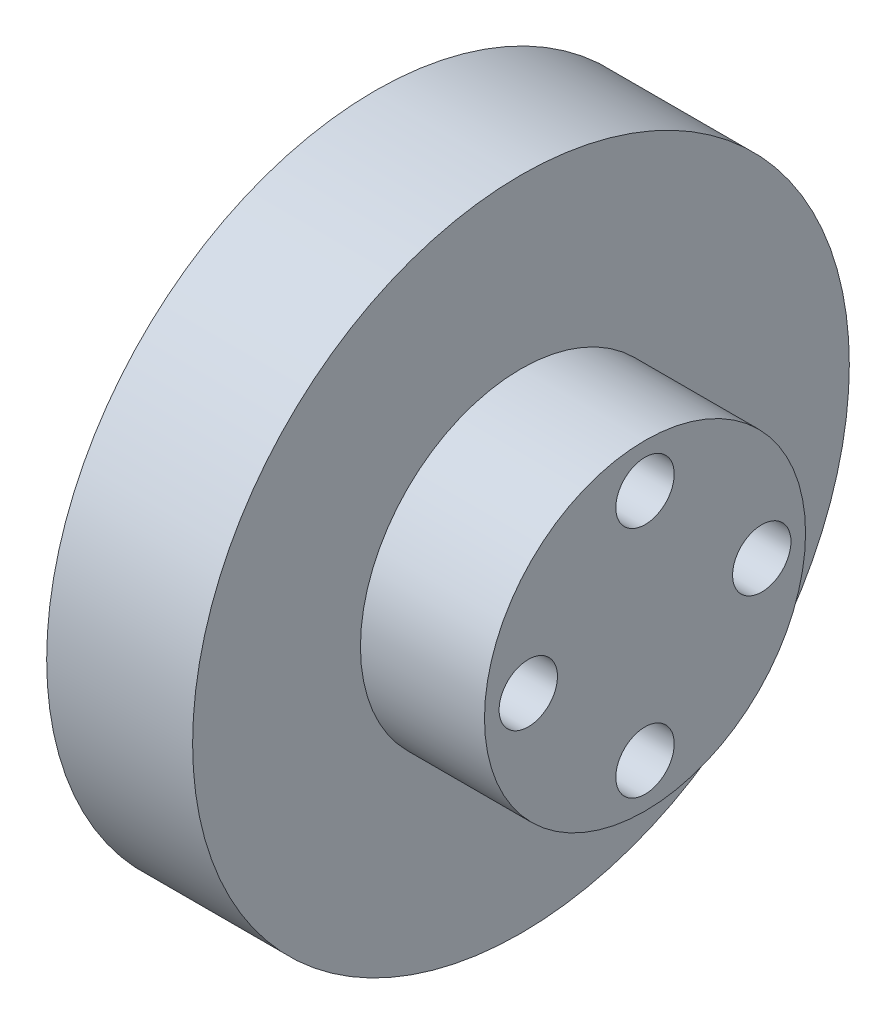
ISO-10303-21;
HEADER;
FILE_DESCRIPTION(('STEP AP214'),'2;1');
FILE_NAME('part.step','',(''),(''),'','','');
FILE_SCHEMA(('AUTOMOTIVE_DESIGN { 1 0 10303 214 1 1 1 1 }'));
ENDSEC;
DATA;
#1=APPLICATION_CONTEXT('core data for automotive mechanical design processes');
#2=APPLICATION_PROTOCOL_DEFINITION('international standard','automotive_design',2000,#1);
#3=PRODUCT_CONTEXT('',#1,'mechanical');
#4=PRODUCT('Part','Part','',(#3));
#5=PRODUCT_RELATED_PRODUCT_CATEGORY('part','',(#4));
#6=PRODUCT_DEFINITION_FORMATION('','',#4);
#7=PRODUCT_DEFINITION_CONTEXT('part definition',#1,'design');
#8=PRODUCT_DEFINITION('design','',#6,#7);
#9=PRODUCT_DEFINITION_SHAPE('','',#8);
#10=(LENGTH_UNIT() NAMED_UNIT(*) SI_UNIT(.MILLI.,.METRE.));
#11=(NAMED_UNIT(*) PLANE_ANGLE_UNIT() SI_UNIT($,.RADIAN.));
#12=(NAMED_UNIT(*) SI_UNIT($,.STERADIAN.) SOLID_ANGLE_UNIT());
#13=UNCERTAINTY_MEASURE_WITH_UNIT(LENGTH_MEASURE(1.E-05),#10,'distance_accuracy_value','');
#14=(GEOMETRIC_REPRESENTATION_CONTEXT(3) GLOBAL_UNCERTAINTY_ASSIGNED_CONTEXT((#13)) GLOBAL_UNIT_ASSIGNED_CONTEXT((#10,
#11,#12)) REPRESENTATION_CONTEXT('',''));
#15=CARTESIAN_POINT('',(0.,0.,0.));
#16=DIRECTION('',(0.,0.,1.));
#17=DIRECTION('',(1.,0.,0.));
#18=AXIS2_PLACEMENT_3D('',#15,#16,#17);
#19=CARTESIAN_POINT('',(10.,0.,0.));
#20=DIRECTION('',(-1.,0.,0.));
#21=DIRECTION('',(0.,0.,1.));
#22=AXIS2_PLACEMENT_3D('',#19,#20,#21);
#23=CYLINDRICAL_SURFACE('',#22,22.5);
#24=CARTESIAN_POINT('',(10.,0.,0.));
#25=DIRECTION('',(1.,0.,0.));
#26=DIRECTION('',(0.,0.,-1.));
#27=AXIS2_PLACEMENT_3D('',#24,#25,#26);
#28=CIRCLE('',#27,22.5);
#29=CARTESIAN_POINT('',(10.,0.,-22.5));
#30=VERTEX_POINT('',#29);
#31=EDGE_CURVE('E37',#30,#30,#28,.T.);
#32=ORIENTED_EDGE('',*,*,#31,.F.);
#33=EDGE_LOOP('',(#32));
#34=FACE_BOUND('',#33,.T.);
#35=CARTESIAN_POINT('',(0.,0.,0.));
#36=DIRECTION('',(1.,0.,0.));
#37=DIRECTION('',(0.,0.,-1.));
#38=AXIS2_PLACEMENT_3D('',#35,#36,#37);
#39=CIRCLE('',#38,22.5);
#40=CARTESIAN_POINT('',(0.,0.,-22.5));
#41=VERTEX_POINT('',#40);
#42=EDGE_CURVE('E33',#41,#41,#39,.T.);
#43=ORIENTED_EDGE('',*,*,#42,.T.);
#44=EDGE_LOOP('',(#43));
#45=FACE_BOUND('',#44,.T.);
#46=ADVANCED_FACE('F30',(#34,#45),#23,.T.);
#47=CARTESIAN_POINT('',(10.,0.,0.));
#48=DIRECTION('',(1.,0.,0.));
#49=DIRECTION('',(0.,0.,-1.));
#50=AXIS2_PLACEMENT_3D('',#47,#48,#49);
#51=PLANE('',#50);
#52=CARTESIAN_POINT('',(10.,0.,0.));
#53=DIRECTION('',(1.,0.,0.));
#54=DIRECTION('',(0.,0.,-1.));
#55=AXIS2_PLACEMENT_3D('',#52,#53,#54);
#56=CIRCLE('',#55,11.);
#57=CARTESIAN_POINT('',(10.,0.,-11.));
#58=VERTEX_POINT('',#57);
#59=EDGE_CURVE('E10',#58,#58,#56,.T.);
#60=ORIENTED_EDGE('',*,*,#59,.F.);
#61=EDGE_LOOP('',(#60));
#62=FACE_BOUND('',#61,.T.);
#63=ORIENTED_EDGE('',*,*,#31,.T.);
#64=EDGE_LOOP('',(#63));
#65=FACE_BOUND('',#64,.T.);
#66=ADVANCED_FACE('F100',(#62,#65),#51,.T.);
#67=CARTESIAN_POINT('',(0.,0.,0.));
#68=DIRECTION('',(1.,0.,0.));
#69=DIRECTION('',(0.,0.,-1.));
#70=AXIS2_PLACEMENT_3D('',#67,#68,#69);
#71=PLANE('',#70);
#72=CARTESIAN_POINT('',(0.,8.,0.));
#73=DIRECTION('',(1.,0.,0.));
#74=DIRECTION('',(0.,0.,-1.));
#75=AXIS2_PLACEMENT_3D('',#72,#73,#74);
#76=CIRCLE('',#75,2.);
#77=CARTESIAN_POINT('',(0.,8.,-2.));
#78=VERTEX_POINT('',#77);
#79=EDGE_CURVE('E46',#78,#78,#76,.T.);
#80=ORIENTED_EDGE('',*,*,#79,.T.);
#81=EDGE_LOOP('',(#80));
#82=FACE_BOUND('',#81,.T.);
#83=CARTESIAN_POINT('',(0.,1.41373759072532E-13,-8.00000000000014));
#84=DIRECTION('',(1.,0.,0.));
#85=DIRECTION('',(0.,0.,-1.));
#86=AXIS2_PLACEMENT_3D('',#83,#84,#85);
#87=CIRCLE('',#86,2.);
#88=CARTESIAN_POINT('',(0.,1.41373759072532E-13,-10.0000000000001));
#89=VERTEX_POINT('',#88);
#90=EDGE_CURVE('E62',#89,#89,#87,.T.);
#91=ORIENTED_EDGE('',*,*,#90,.T.);
#92=EDGE_LOOP('',(#91));
#93=FACE_BOUND('',#92,.T.);
#94=CARTESIAN_POINT('',(0.,-8.,-2.82747518145063E-13));
#95=DIRECTION('',(1.,0.,0.));
#96=DIRECTION('',(0.,0.,-1.));
#97=AXIS2_PLACEMENT_3D('',#94,#95,#96);
#98=CIRCLE('',#97,2.);
#99=CARTESIAN_POINT('',(0.,-8.,-2.00000000000028));
#100=VERTEX_POINT('',#99);
#101=EDGE_CURVE('E56',#100,#100,#98,.T.);
#102=ORIENTED_EDGE('',*,*,#101,.T.);
#103=EDGE_LOOP('',(#102));
#104=FACE_BOUND('',#103,.T.);
#105=CARTESIAN_POINT('',(0.,-1.4235347651185E-13,7.99999999999986));
#106=DIRECTION('',(1.,0.,0.));
#107=DIRECTION('',(0.,0.,-1.));
#108=AXIS2_PLACEMENT_3D('',#105,#106,#107);
#109=CIRCLE('',#108,2.);
#110=CARTESIAN_POINT('',(0.,-1.4235347651185E-13,5.99999999999986));
#111=VERTEX_POINT('',#110);
#112=EDGE_CURVE('E50',#111,#111,#109,.T.);
#113=ORIENTED_EDGE('',*,*,#112,.T.);
#114=EDGE_LOOP('',(#113));
#115=FACE_BOUND('',#114,.T.);
#116=ORIENTED_EDGE('',*,*,#42,.F.);
#117=EDGE_LOOP('',(#116));
#118=FACE_BOUND('',#117,.T.);
#119=ADVANCED_FACE('F71',(#82,#93,#104,#115,#118),#71,.F.);
#120=CARTESIAN_POINT('',(18.5,0.,0.));
#121=DIRECTION('',(-1.,0.,0.));
#122=DIRECTION('',(0.,0.,1.));
#123=AXIS2_PLACEMENT_3D('',#120,#121,#122);
#124=CYLINDRICAL_SURFACE('',#123,11.);
#125=CARTESIAN_POINT('',(18.5,0.,0.));
#126=DIRECTION('',(1.,0.,0.));
#127=DIRECTION('',(0.,0.,-1.));
#128=AXIS2_PLACEMENT_3D('',#125,#126,#127);
#129=CIRCLE('',#128,11.);
#130=CARTESIAN_POINT('',(18.5,0.,-11.));
#131=VERTEX_POINT('',#130);
#132=EDGE_CURVE('E43',#131,#131,#129,.T.);
#133=ORIENTED_EDGE('',*,*,#132,.F.);
#134=EDGE_LOOP('',(#133));
#135=FACE_BOUND('',#134,.T.);
#136=ORIENTED_EDGE('',*,*,#59,.T.);
#137=EDGE_LOOP('',(#136));
#138=FACE_BOUND('',#137,.T.);
#139=ADVANCED_FACE('F85',(#135,#138),#124,.T.);
#140=CARTESIAN_POINT('',(18.5,0.,0.));
#141=DIRECTION('',(1.,0.,0.));
#142=DIRECTION('',(0.,0.,-1.));
#143=AXIS2_PLACEMENT_3D('',#140,#141,#142);
#144=PLANE('',#143);
#145=CARTESIAN_POINT('',(18.5,8.,0.));
#146=DIRECTION('',(1.,0.,0.));
#147=DIRECTION('',(0.,0.,-1.));
#148=AXIS2_PLACEMENT_3D('',#145,#146,#147);
#149=CIRCLE('',#148,2.);
#150=CARTESIAN_POINT('',(18.5,8.,-2.));
#151=VERTEX_POINT('',#150);
#152=EDGE_CURVE('E65',#151,#151,#149,.T.);
#153=ORIENTED_EDGE('',*,*,#152,.F.);
#154=EDGE_LOOP('',(#153));
#155=FACE_BOUND('',#154,.T.);
#156=CARTESIAN_POINT('',(18.5,1.41373759072532E-13,-8.00000000000014));
#157=DIRECTION('',(1.,0.,0.));
#158=DIRECTION('',(0.,0.,-1.));
#159=AXIS2_PLACEMENT_3D('',#156,#157,#158);
#160=CIRCLE('',#159,2.);
#161=CARTESIAN_POINT('',(18.5,1.41373759072532E-13,-10.0000000000001));
#162=VERTEX_POINT('',#161);
#163=EDGE_CURVE('E59',#162,#162,#160,.T.);
#164=ORIENTED_EDGE('',*,*,#163,.F.);
#165=EDGE_LOOP('',(#164));
#166=FACE_BOUND('',#165,.T.);
#167=CARTESIAN_POINT('',(18.5,-8.,-2.82747518145063E-13));
#168=DIRECTION('',(1.,0.,0.));
#169=DIRECTION('',(0.,0.,-1.));
#170=AXIS2_PLACEMENT_3D('',#167,#168,#169);
#171=CIRCLE('',#170,2.);
#172=CARTESIAN_POINT('',(18.5,-8.,-2.00000000000028));
#173=VERTEX_POINT('',#172);
#174=EDGE_CURVE('E53',#173,#173,#171,.T.);
#175=ORIENTED_EDGE('',*,*,#174,.F.);
#176=EDGE_LOOP('',(#175));
#177=FACE_BOUND('',#176,.T.);
#178=CARTESIAN_POINT('',(18.5,-1.4235347651185E-13,7.99999999999986));
#179=DIRECTION('',(1.,0.,0.));
#180=DIRECTION('',(0.,0.,-1.));
#181=AXIS2_PLACEMENT_3D('',#178,#179,#180);
#182=CIRCLE('',#181,2.);
#183=CARTESIAN_POINT('',(18.5,-1.4235347651185E-13,5.99999999999986));
#184=VERTEX_POINT('',#183);
#185=EDGE_CURVE('E47',#184,#184,#182,.T.);
#186=ORIENTED_EDGE('',*,*,#185,.F.);
#187=EDGE_LOOP('',(#186));
#188=FACE_BOUND('',#187,.T.);
#189=ORIENTED_EDGE('',*,*,#132,.T.);
#190=EDGE_LOOP('',(#189));
#191=FACE_BOUND('',#190,.T.);
#192=ADVANCED_FACE('F81',(#155,#166,#177,#188,#191),#144,.T.);
#193=CARTESIAN_POINT('',(0.,-1.4235347651185E-13,7.99999999999986));
#194=DIRECTION('',(1.,0.,0.));
#195=DIRECTION('',(0.,0.,-1.));
#196=AXIS2_PLACEMENT_3D('',#193,#194,#195);
#197=CYLINDRICAL_SURFACE('',#196,2.);
#198=ORIENTED_EDGE('',*,*,#112,.F.);
#199=EDGE_LOOP('',(#198));
#200=FACE_BOUND('',#199,.T.);
#201=ORIENTED_EDGE('',*,*,#185,.T.);
#202=EDGE_LOOP('',(#201));
#203=FACE_BOUND('',#202,.T.);
#204=ADVANCED_FACE('F84',(#200,#203),#197,.F.);
#205=CARTESIAN_POINT('',(0.,-8.,-2.82747518145063E-13));
#206=DIRECTION('',(1.,0.,0.));
#207=DIRECTION('',(0.,0.,-1.));
#208=AXIS2_PLACEMENT_3D('',#205,#206,#207);
#209=CYLINDRICAL_SURFACE('',#208,2.);
#210=ORIENTED_EDGE('',*,*,#101,.F.);
#211=EDGE_LOOP('',(#210));
#212=FACE_BOUND('',#211,.T.);
#213=ORIENTED_EDGE('',*,*,#174,.T.);
#214=EDGE_LOOP('',(#213));
#215=FACE_BOUND('',#214,.T.);
#216=ADVANCED_FACE('F137',(#212,#215),#209,.F.);
#217=CARTESIAN_POINT('',(0.,1.41373759072532E-13,-8.00000000000014));
#218=DIRECTION('',(1.,0.,0.));
#219=DIRECTION('',(0.,0.,-1.));
#220=AXIS2_PLACEMENT_3D('',#217,#218,#219);
#221=CYLINDRICAL_SURFACE('',#220,2.);
#222=ORIENTED_EDGE('',*,*,#90,.F.);
#223=EDGE_LOOP('',(#222));
#224=FACE_BOUND('',#223,.T.);
#225=ORIENTED_EDGE('',*,*,#163,.T.);
#226=EDGE_LOOP('',(#225));
#227=FACE_BOUND('',#226,.T.);
#228=ADVANCED_FACE('F77',(#224,#227),#221,.F.);
#229=CARTESIAN_POINT('',(0.,8.,0.));
#230=DIRECTION('',(1.,0.,0.));
#231=DIRECTION('',(0.,0.,-1.));
#232=AXIS2_PLACEMENT_3D('',#229,#230,#231);
#233=CYLINDRICAL_SURFACE('',#232,2.);
#234=ORIENTED_EDGE('',*,*,#79,.F.);
#235=EDGE_LOOP('',(#234));
#236=FACE_BOUND('',#235,.T.);
#237=ORIENTED_EDGE('',*,*,#152,.T.);
#238=EDGE_LOOP('',(#237));
#239=FACE_BOUND('',#238,.T.);
#240=ADVANCED_FACE('F74',(#236,#239),#233,.F.);
#241=CLOSED_SHELL('',(#46,#66,#119,#139,#192,#204,#216,#228,#240));
#242=MANIFOLD_SOLID_BREP('B2',#241);
#243=ADVANCED_BREP_SHAPE_REPRESENTATION('',(#18,#242),#14);
#244=SHAPE_DEFINITION_REPRESENTATION(#9,#243);
ENDSEC;
END-ISO-10303-21;
